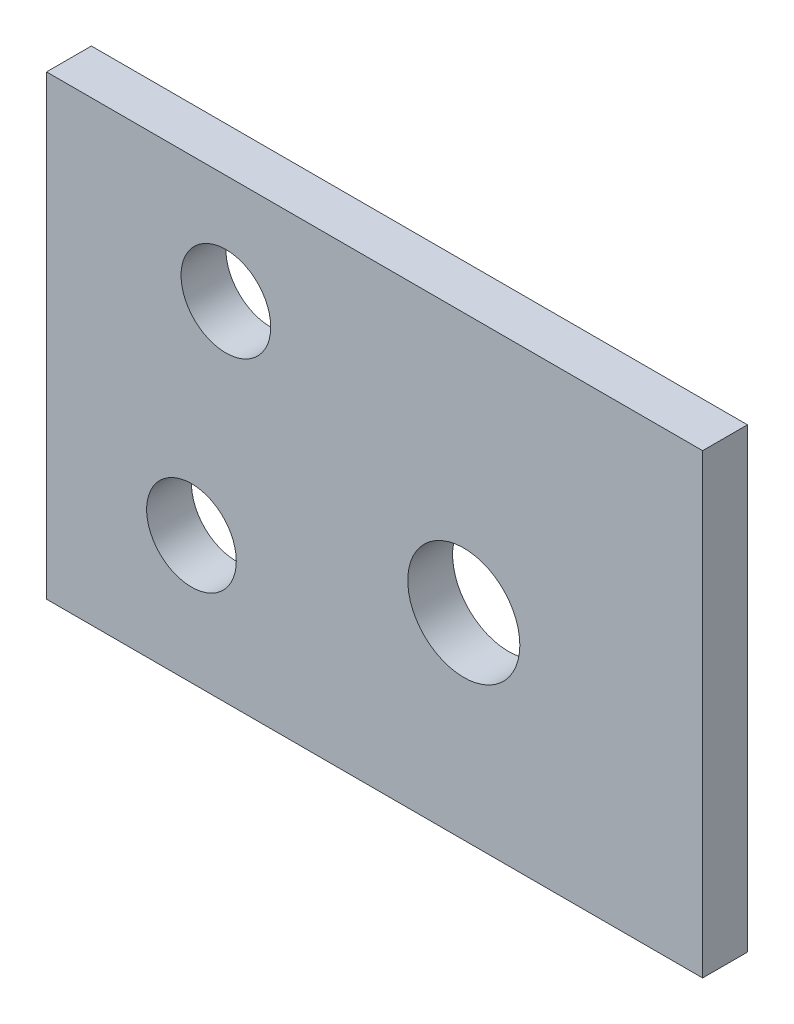
ISO-10303-21;
HEADER;
FILE_DESCRIPTION(('STEP AP214'),'2;1');
FILE_NAME('part.step','',(''),(''),'','','');
FILE_SCHEMA(('AUTOMOTIVE_DESIGN { 1 0 10303 214 1 1 1 1 }'));
ENDSEC;
DATA;
#1=APPLICATION_CONTEXT('core data for automotive mechanical design processes');
#2=APPLICATION_PROTOCOL_DEFINITION('international standard','automotive_design',2000,#1);
#3=PRODUCT_CONTEXT('',#1,'mechanical');
#4=PRODUCT('Part','Part','',(#3));
#5=PRODUCT_RELATED_PRODUCT_CATEGORY('part','',(#4));
#6=PRODUCT_DEFINITION_FORMATION('','',#4);
#7=PRODUCT_DEFINITION_CONTEXT('part definition',#1,'design');
#8=PRODUCT_DEFINITION('design','',#6,#7);
#9=PRODUCT_DEFINITION_SHAPE('','',#8);
#10=(LENGTH_UNIT() NAMED_UNIT(*) SI_UNIT(.MILLI.,.METRE.));
#11=(NAMED_UNIT(*) PLANE_ANGLE_UNIT() SI_UNIT($,.RADIAN.));
#12=(NAMED_UNIT(*) SI_UNIT($,.STERADIAN.) SOLID_ANGLE_UNIT());
#13=UNCERTAINTY_MEASURE_WITH_UNIT(LENGTH_MEASURE(1.E-05),#10,'distance_accuracy_value','');
#14=(GEOMETRIC_REPRESENTATION_CONTEXT(3) GLOBAL_UNCERTAINTY_ASSIGNED_CONTEXT((#13)) GLOBAL_UNIT_ASSIGNED_CONTEXT((#10,
#11,#12)) REPRESENTATION_CONTEXT('',''));
#15=CARTESIAN_POINT('',(0.,0.,0.));
#16=DIRECTION('',(0.,0.,1.));
#17=DIRECTION('',(1.,0.,0.));
#18=AXIS2_PLACEMENT_3D('',#15,#16,#17);
#19=CARTESIAN_POINT('',(0.,0.,2.));
#20=DIRECTION('',(0.,0.,-1.));
#21=DIRECTION('',(-1.,0.,0.));
#22=AXIS2_PLACEMENT_3D('',#19,#20,#21);
#23=PLANE('',#22);
#24=DIRECTION('',(0.,-1.,0.));
#25=VECTOR('',#24,1.);
#26=CARTESIAN_POINT('',(0.,0.,2.));
#27=LINE('',#26,#25);
#28=CARTESIAN_POINT('',(0.,20.3729420692975,2.));
#29=VERTEX_POINT('',#28);
#30=CARTESIAN_POINT('',(0.,0.,2.));
#31=VERTEX_POINT('',#30);
#32=EDGE_CURVE('E85',#29,#31,#27,.T.);
#33=ORIENTED_EDGE('',*,*,#32,.T.);
#34=DIRECTION('',(1.,0.,0.));
#35=VECTOR('',#34,1.);
#36=CARTESIAN_POINT('',(0.,0.,2.));
#37=LINE('',#36,#35);
#38=CARTESIAN_POINT('',(29.2676204701248,0.,2.));
#39=VERTEX_POINT('',#38);
#40=EDGE_CURVE('E80',#31,#39,#37,.T.);
#41=ORIENTED_EDGE('',*,*,#40,.T.);
#42=DIRECTION('',(0.,1.,0.));
#43=VECTOR('',#42,1.);
#44=CARTESIAN_POINT('',(29.2676204701248,0.,2.));
#45=LINE('',#44,#43);
#46=CARTESIAN_POINT('',(29.2676204701248,20.3729420692975,2.));
#47=VERTEX_POINT('',#46);
#48=EDGE_CURVE('E83',#39,#47,#45,.T.);
#49=ORIENTED_EDGE('',*,*,#48,.T.);
#50=DIRECTION('',(-1.,0.,0.));
#51=VECTOR('',#50,1.);
#52=CARTESIAN_POINT('',(0.,20.3729420692975,2.));
#53=LINE('',#52,#51);
#54=EDGE_CURVE('E50',#47,#29,#53,.T.);
#55=ORIENTED_EDGE('',*,*,#54,.T.);
#56=EDGE_LOOP('',(#33,#41,#49,#55));
#57=FACE_BOUND('',#56,.T.);
#58=CARTESIAN_POINT('',(8.,15.5133412087311,2.));
#59=DIRECTION('',(0.,0.,1.));
#60=DIRECTION('',(1.,0.,0.));
#61=AXIS2_PLACEMENT_3D('',#58,#59,#60);
#62=CIRCLE('',#61,2.);
#63=CARTESIAN_POINT('',(10.,15.5133412087311,2.));
#64=VERTEX_POINT('',#63);
#65=EDGE_CURVE('E100',#64,#64,#62,.T.);
#66=ORIENTED_EDGE('',*,*,#65,.F.);
#67=EDGE_LOOP('',(#66));
#68=FACE_BOUND('',#67,.T.);
#69=CARTESIAN_POINT('',(6.46487797054412,5.70068562489517,2.));
#70=DIRECTION('',(0.,0.,1.));
#71=DIRECTION('',(1.,0.,0.));
#72=AXIS2_PLACEMENT_3D('',#69,#70,#71);
#73=CIRCLE('',#72,2.);
#74=CARTESIAN_POINT('',(8.46487797054412,5.70068562489517,2.));
#75=VERTEX_POINT('',#74);
#76=EDGE_CURVE('E115',#75,#75,#73,.T.);
#77=ORIENTED_EDGE('',*,*,#76,.F.);
#78=EDGE_LOOP('',(#77));
#79=FACE_BOUND('',#78,.T.);
#80=CARTESIAN_POINT('',(18.6138801219601,8.78466309410076,2.));
#81=DIRECTION('',(0.,0.,1.));
#82=DIRECTION('',(1.,0.,0.));
#83=AXIS2_PLACEMENT_3D('',#80,#81,#82);
#84=CIRCLE('',#83,2.5);
#85=CARTESIAN_POINT('',(21.1138801219601,8.78466309410076,2.));
#86=VERTEX_POINT('',#85);
#87=EDGE_CURVE('E121',#86,#86,#84,.T.);
#88=ORIENTED_EDGE('',*,*,#87,.F.);
#89=EDGE_LOOP('',(#88));
#90=FACE_BOUND('',#89,.T.);
#91=ADVANCED_FACE('F33',(#57,#68,#79,#90),#23,.F.);
#92=CARTESIAN_POINT('',(0.,0.,0.));
#93=DIRECTION('',(0.,0.,-1.));
#94=DIRECTION('',(-1.,0.,0.));
#95=AXIS2_PLACEMENT_3D('',#92,#93,#94);
#96=PLANE('',#95);
#97=CARTESIAN_POINT('',(6.46487797054412,5.70068562489517,0.));
#98=DIRECTION('',(0.,0.,1.));
#99=DIRECTION('',(1.,0.,0.));
#100=AXIS2_PLACEMENT_3D('',#97,#98,#99);
#101=CIRCLE('',#100,2.);
#102=CARTESIAN_POINT('',(8.46487797054412,5.70068562489517,0.));
#103=VERTEX_POINT('',#102);
#104=EDGE_CURVE('E118',#103,#103,#101,.T.);
#105=ORIENTED_EDGE('',*,*,#104,.T.);
#106=EDGE_LOOP('',(#105));
#107=FACE_BOUND('',#106,.T.);
#108=DIRECTION('',(0.,-1.,0.));
#109=VECTOR('',#108,1.);
#110=CARTESIAN_POINT('',(0.,0.,0.));
#111=LINE('',#110,#109);
#112=CARTESIAN_POINT('',(0.,20.3729420692975,0.));
#113=VERTEX_POINT('',#112);
#114=CARTESIAN_POINT('',(0.,0.,0.));
#115=VERTEX_POINT('',#114);
#116=EDGE_CURVE('E97',#113,#115,#111,.T.);
#117=ORIENTED_EDGE('',*,*,#116,.F.);
#118=DIRECTION('',(-1.,0.,0.));
#119=VECTOR('',#118,1.);
#120=CARTESIAN_POINT('',(0.,20.3729420692975,0.));
#121=LINE('',#120,#119);
#122=CARTESIAN_POINT('',(29.2676204701248,20.3729420692975,0.));
#123=VERTEX_POINT('',#122);
#124=EDGE_CURVE('E73',#123,#113,#121,.T.);
#125=ORIENTED_EDGE('',*,*,#124,.F.);
#126=DIRECTION('',(0.,1.,0.));
#127=VECTOR('',#126,1.);
#128=CARTESIAN_POINT('',(29.2676204701248,0.,0.));
#129=LINE('',#128,#127);
#130=CARTESIAN_POINT('',(29.2676204701248,0.,0.));
#131=VERTEX_POINT('',#130);
#132=EDGE_CURVE('E67',#131,#123,#129,.T.);
#133=ORIENTED_EDGE('',*,*,#132,.F.);
#134=DIRECTION('',(1.,0.,0.));
#135=VECTOR('',#134,1.);
#136=CARTESIAN_POINT('',(0.,0.,0.));
#137=LINE('',#136,#135);
#138=EDGE_CURVE('E89',#115,#131,#137,.T.);
#139=ORIENTED_EDGE('',*,*,#138,.F.);
#140=EDGE_LOOP('',(#117,#125,#133,#139));
#141=FACE_BOUND('',#140,.T.);
#142=CARTESIAN_POINT('',(8.,15.5133412087311,0.));
#143=DIRECTION('',(0.,0.,1.));
#144=DIRECTION('',(1.,0.,0.));
#145=AXIS2_PLACEMENT_3D('',#142,#143,#144);
#146=CIRCLE('',#145,2.);
#147=CARTESIAN_POINT('',(10.,15.5133412087311,0.));
#148=VERTEX_POINT('',#147);
#149=EDGE_CURVE('E112',#148,#148,#146,.T.);
#150=ORIENTED_EDGE('',*,*,#149,.T.);
#151=EDGE_LOOP('',(#150));
#152=FACE_BOUND('',#151,.T.);
#153=CARTESIAN_POINT('',(18.6138801219601,8.78466309410076,0.));
#154=DIRECTION('',(0.,0.,1.));
#155=DIRECTION('',(1.,0.,0.));
#156=AXIS2_PLACEMENT_3D('',#153,#154,#155);
#157=CIRCLE('',#156,2.5);
#158=CARTESIAN_POINT('',(21.1138801219601,8.78466309410076,0.));
#159=VERTEX_POINT('',#158);
#160=EDGE_CURVE('E124',#159,#159,#157,.T.);
#161=ORIENTED_EDGE('',*,*,#160,.T.);
#162=EDGE_LOOP('',(#161));
#163=FACE_BOUND('',#162,.T.);
#164=ADVANCED_FACE('F108',(#107,#141,#152,#163),#96,.T.);
#165=CARTESIAN_POINT('',(0.,0.,2.));
#166=DIRECTION('',(1.,0.,0.));
#167=DIRECTION('',(0.,0.,-1.));
#168=AXIS2_PLACEMENT_3D('',#165,#166,#167);
#169=PLANE('',#168);
#170=ORIENTED_EDGE('',*,*,#116,.T.);
#171=DIRECTION('',(0.,0.,-1.));
#172=VECTOR('',#171,1.);
#173=CARTESIAN_POINT('',(0.,0.,2.));
#174=LINE('',#173,#172);
#175=EDGE_CURVE('E11',#31,#115,#174,.T.);
#176=ORIENTED_EDGE('',*,*,#175,.F.);
#177=ORIENTED_EDGE('',*,*,#32,.F.);
#178=DIRECTION('',(0.,0.,-1.));
#179=VECTOR('',#178,1.);
#180=CARTESIAN_POINT('',(0.,20.3729420692975,2.));
#181=LINE('',#180,#179);
#182=EDGE_CURVE('E93',#29,#113,#181,.T.);
#183=ORIENTED_EDGE('',*,*,#182,.T.);
#184=EDGE_LOOP('',(#170,#176,#177,#183));
#185=FACE_BOUND('',#184,.T.);
#186=ADVANCED_FACE('F35',(#185),#169,.F.);
#187=CARTESIAN_POINT('',(0.,0.,2.));
#188=DIRECTION('',(0.,1.,0.));
#189=DIRECTION('',(0.,0.,1.));
#190=AXIS2_PLACEMENT_3D('',#187,#188,#189);
#191=PLANE('',#190);
#192=ORIENTED_EDGE('',*,*,#138,.T.);
#193=DIRECTION('',(0.,0.,-1.));
#194=VECTOR('',#193,1.);
#195=CARTESIAN_POINT('',(29.2676204701248,0.,2.));
#196=LINE('',#195,#194);
#197=EDGE_CURVE('E42',#39,#131,#196,.T.);
#198=ORIENTED_EDGE('',*,*,#197,.F.);
#199=ORIENTED_EDGE('',*,*,#40,.F.);
#200=ORIENTED_EDGE('',*,*,#175,.T.);
#201=EDGE_LOOP('',(#192,#198,#199,#200));
#202=FACE_BOUND('',#201,.T.);
#203=ADVANCED_FACE('F88',(#202),#191,.F.);
#204=CARTESIAN_POINT('',(29.2676204701248,0.,2.));
#205=DIRECTION('',(-1.,0.,0.));
#206=DIRECTION('',(0.,0.,1.));
#207=AXIS2_PLACEMENT_3D('',#204,#205,#206);
#208=PLANE('',#207);
#209=ORIENTED_EDGE('',*,*,#132,.T.);
#210=DIRECTION('',(0.,0.,-1.));
#211=VECTOR('',#210,1.);
#212=CARTESIAN_POINT('',(29.2676204701248,20.3729420692975,2.));
#213=LINE('',#212,#211);
#214=EDGE_CURVE('E90',#47,#123,#213,.T.);
#215=ORIENTED_EDGE('',*,*,#214,.F.);
#216=ORIENTED_EDGE('',*,*,#48,.F.);
#217=ORIENTED_EDGE('',*,*,#197,.T.);
#218=EDGE_LOOP('',(#209,#215,#216,#217));
#219=FACE_BOUND('',#218,.T.);
#220=ADVANCED_FACE('F91',(#219),#208,.F.);
#221=CARTESIAN_POINT('',(0.,20.3729420692975,2.));
#222=DIRECTION('',(0.,-1.,0.));
#223=DIRECTION('',(0.,0.,-1.));
#224=AXIS2_PLACEMENT_3D('',#221,#222,#223);
#225=PLANE('',#224);
#226=ORIENTED_EDGE('',*,*,#124,.T.);
#227=ORIENTED_EDGE('',*,*,#182,.F.);
#228=ORIENTED_EDGE('',*,*,#54,.F.);
#229=ORIENTED_EDGE('',*,*,#214,.T.);
#230=EDGE_LOOP('',(#226,#227,#228,#229));
#231=FACE_BOUND('',#230,.T.);
#232=ADVANCED_FACE('F105',(#231),#225,.F.);
#233=CARTESIAN_POINT('',(8.,15.5133412087311,2.));
#234=DIRECTION('',(0.,0.,-1.));
#235=DIRECTION('',(-1.,0.,0.));
#236=AXIS2_PLACEMENT_3D('',#233,#234,#235);
#237=CYLINDRICAL_SURFACE('',#236,2.);
#238=ORIENTED_EDGE('',*,*,#65,.T.);
#239=EDGE_LOOP('',(#238));
#240=FACE_BOUND('',#239,.T.);
#241=ORIENTED_EDGE('',*,*,#149,.F.);
#242=EDGE_LOOP('',(#241));
#243=FACE_BOUND('',#242,.T.);
#244=ADVANCED_FACE('F141',(#240,#243),#237,.F.);
#245=CARTESIAN_POINT('',(6.46487797054412,5.70068562489517,2.));
#246=DIRECTION('',(0.,0.,-1.));
#247=DIRECTION('',(-1.,0.,0.));
#248=AXIS2_PLACEMENT_3D('',#245,#246,#247);
#249=CYLINDRICAL_SURFACE('',#248,2.);
#250=ORIENTED_EDGE('',*,*,#76,.T.);
#251=EDGE_LOOP('',(#250));
#252=FACE_BOUND('',#251,.T.);
#253=ORIENTED_EDGE('',*,*,#104,.F.);
#254=EDGE_LOOP('',(#253));
#255=FACE_BOUND('',#254,.T.);
#256=ADVANCED_FACE('F187',(#252,#255),#249,.F.);
#257=CARTESIAN_POINT('',(18.6138801219601,8.78466309410076,2.));
#258=DIRECTION('',(0.,0.,-1.));
#259=DIRECTION('',(-1.,0.,0.));
#260=AXIS2_PLACEMENT_3D('',#257,#258,#259);
#261=CYLINDRICAL_SURFACE('',#260,2.5);
#262=ORIENTED_EDGE('',*,*,#87,.T.);
#263=EDGE_LOOP('',(#262));
#264=FACE_BOUND('',#263,.T.);
#265=ORIENTED_EDGE('',*,*,#160,.F.);
#266=EDGE_LOOP('',(#265));
#267=FACE_BOUND('',#266,.T.);
#268=ADVANCED_FACE('F130',(#264,#267),#261,.F.);
#269=CLOSED_SHELL('',(#91,#164,#186,#203,#220,#232,#244,#256,#268));
#270=MANIFOLD_SOLID_BREP('B2',#269);
#271=ADVANCED_BREP_SHAPE_REPRESENTATION('',(#18,#270),#14);
#272=SHAPE_DEFINITION_REPRESENTATION(#9,#271);
ENDSEC;
END-ISO-10303-21;
